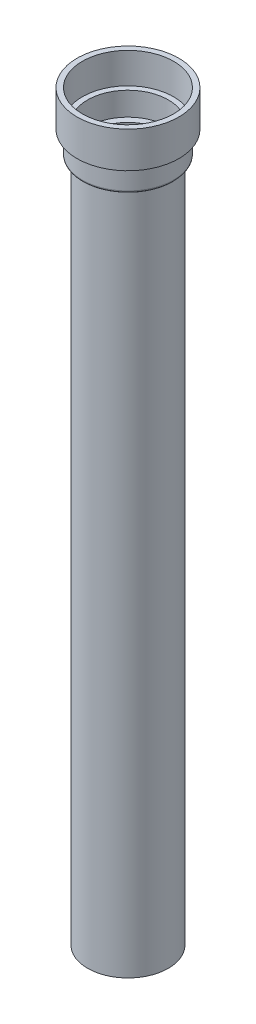
ISO-10303-21;
HEADER;
FILE_DESCRIPTION(('STEP AP214'),'2;1');
FILE_NAME('part.step','',(''),(''),'','','');
FILE_SCHEMA(('AUTOMOTIVE_DESIGN { 1 0 10303 214 1 1 1 1 }'));
ENDSEC;
DATA;
#1=APPLICATION_CONTEXT('core data for automotive mechanical design processes');
#2=APPLICATION_PROTOCOL_DEFINITION('international standard','automotive_design',2000,#1);
#3=PRODUCT_CONTEXT('',#1,'mechanical');
#4=PRODUCT('Part','Part','',(#3));
#5=PRODUCT_RELATED_PRODUCT_CATEGORY('part','',(#4));
#6=PRODUCT_DEFINITION_FORMATION('','',#4);
#7=PRODUCT_DEFINITION_CONTEXT('part definition',#1,'design');
#8=PRODUCT_DEFINITION('design','',#6,#7);
#9=PRODUCT_DEFINITION_SHAPE('','',#8);
#10=(LENGTH_UNIT() NAMED_UNIT(*) SI_UNIT(.MILLI.,.METRE.));
#11=(NAMED_UNIT(*) PLANE_ANGLE_UNIT() SI_UNIT($,.RADIAN.));
#12=(NAMED_UNIT(*) SI_UNIT($,.STERADIAN.) SOLID_ANGLE_UNIT());
#13=UNCERTAINTY_MEASURE_WITH_UNIT(LENGTH_MEASURE(1.E-05),#10,'distance_accuracy_value','');
#14=(GEOMETRIC_REPRESENTATION_CONTEXT(3) GLOBAL_UNCERTAINTY_ASSIGNED_CONTEXT((#13)) GLOBAL_UNIT_ASSIGNED_CONTEXT((#10,
#11,#12)) REPRESENTATION_CONTEXT('',''));
#15=CARTESIAN_POINT('',(0.,0.,0.));
#16=DIRECTION('',(0.,0.,1.));
#17=DIRECTION('',(1.,0.,0.));
#18=AXIS2_PLACEMENT_3D('',#15,#16,#17);
#19=CARTESIAN_POINT('',(0.,-347.5,0.));
#20=DIRECTION('',(0.,1.,0.));
#21=DIRECTION('',(0.,0.,1.));
#22=AXIS2_PLACEMENT_3D('',#19,#20,#21);
#23=PLANE('',#22);
#24=CARTESIAN_POINT('',(0.,-347.5,0.));
#25=DIRECTION('',(0.,1.,0.));
#26=DIRECTION('',(0.,0.,1.));
#27=AXIS2_PLACEMENT_3D('',#24,#25,#26);
#28=CIRCLE('',#27,16.);
#29=CARTESIAN_POINT('',(0.,-347.5,16.));
#30=VERTEX_POINT('',#29);
#31=EDGE_CURVE('E41',#30,#30,#28,.T.);
#32=ORIENTED_EDGE('',*,*,#31,.T.);
#33=EDGE_LOOP('',(#32));
#34=FACE_BOUND('',#33,.T.);
#35=ADVANCED_FACE('F30',(#34),#23,.T.);
#36=CARTESIAN_POINT('',(0.,0.,0.));
#37=DIRECTION('',(0.,1.,0.));
#38=DIRECTION('',(0.,0.,1.));
#39=AXIS2_PLACEMENT_3D('',#36,#37,#38);
#40=CYLINDRICAL_SURFACE('',#39,16.);
#41=CARTESIAN_POINT('',(0.,-25.5,0.));
#42=DIRECTION('',(0.,1.,0.));
#43=DIRECTION('',(0.,0.,1.));
#44=AXIS2_PLACEMENT_3D('',#41,#42,#43);
#45=CIRCLE('',#44,16.);
#46=CARTESIAN_POINT('',(0.,-25.5,16.));
#47=VERTEX_POINT('',#46);
#48=EDGE_CURVE('E45',#47,#47,#45,.T.);
#49=ORIENTED_EDGE('',*,*,#48,.T.);
#50=EDGE_LOOP('',(#49));
#51=FACE_BOUND('',#50,.T.);
#52=ORIENTED_EDGE('',*,*,#31,.F.);
#53=EDGE_LOOP('',(#52));
#54=FACE_BOUND('',#53,.T.);
#55=ADVANCED_FACE('F92',(#51,#54),#40,.F.);
#56=CARTESIAN_POINT('',(0.,-25.5,19.));
#57=DIRECTION('',(0.,1.,0.));
#58=DIRECTION('',(0.,0.,1.));
#59=AXIS2_PLACEMENT_3D('',#56,#57,#58);
#60=PLANE('',#59);
#61=CARTESIAN_POINT('',(0.,-25.5,0.));
#62=DIRECTION('',(0.,1.,0.));
#63=DIRECTION('',(0.,0.,1.));
#64=AXIS2_PLACEMENT_3D('',#61,#62,#63);
#65=CIRCLE('',#64,19.);
#66=CARTESIAN_POINT('',(0.,-25.5,19.));
#67=VERTEX_POINT('',#66);
#68=EDGE_CURVE('E50',#67,#67,#65,.T.);
#69=ORIENTED_EDGE('',*,*,#68,.T.);
#70=EDGE_LOOP('',(#69));
#71=FACE_BOUND('',#70,.T.);
#72=ORIENTED_EDGE('',*,*,#48,.F.);
#73=EDGE_LOOP('',(#72));
#74=FACE_BOUND('',#73,.T.);
#75=ADVANCED_FACE('F97',(#71,#74),#60,.T.);
#76=CARTESIAN_POINT('',(0.,0.,0.));
#77=DIRECTION('',(0.,1.,0.));
#78=DIRECTION('',(0.,0.,1.));
#79=AXIS2_PLACEMENT_3D('',#76,#77,#78);
#80=CYLINDRICAL_SURFACE('',#79,19.);
#81=CARTESIAN_POINT('',(0.,-14.5,0.));
#82=DIRECTION('',(0.,1.,0.));
#83=DIRECTION('',(0.,0.,1.));
#84=AXIS2_PLACEMENT_3D('',#81,#82,#83);
#85=CIRCLE('',#84,19.);
#86=CARTESIAN_POINT('',(0.,-14.5,19.));
#87=VERTEX_POINT('',#86);
#88=EDGE_CURVE('E53',#87,#87,#85,.T.);
#89=ORIENTED_EDGE('',*,*,#88,.T.);
#90=EDGE_LOOP('',(#89));
#91=FACE_BOUND('',#90,.T.);
#92=ORIENTED_EDGE('',*,*,#68,.F.);
#93=EDGE_LOOP('',(#92));
#94=FACE_BOUND('',#93,.T.);
#95=ADVANCED_FACE('F103',(#91,#94),#80,.F.);
#96=CARTESIAN_POINT('',(0.,-14.5,21.5));
#97=DIRECTION('',(0.,1.,0.));
#98=DIRECTION('',(0.,0.,1.));
#99=AXIS2_PLACEMENT_3D('',#96,#97,#98);
#100=PLANE('',#99);
#101=CARTESIAN_POINT('',(0.,-14.5,0.));
#102=DIRECTION('',(0.,1.,0.));
#103=DIRECTION('',(0.,0.,1.));
#104=AXIS2_PLACEMENT_3D('',#101,#102,#103);
#105=CIRCLE('',#104,21.5);
#106=CARTESIAN_POINT('',(0.,-14.5,21.5));
#107=VERTEX_POINT('',#106);
#108=EDGE_CURVE('E56',#107,#107,#105,.T.);
#109=ORIENTED_EDGE('',*,*,#108,.T.);
#110=EDGE_LOOP('',(#109));
#111=FACE_BOUND('',#110,.T.);
#112=ORIENTED_EDGE('',*,*,#88,.F.);
#113=EDGE_LOOP('',(#112));
#114=FACE_BOUND('',#113,.T.);
#115=ADVANCED_FACE('F107',(#111,#114),#100,.T.);
#116=CARTESIAN_POINT('',(0.,0.,0.));
#117=DIRECTION('',(0.,1.,0.));
#118=DIRECTION('',(0.,0.,1.));
#119=AXIS2_PLACEMENT_3D('',#116,#117,#118);
#120=CYLINDRICAL_SURFACE('',#119,21.5);
#121=CARTESIAN_POINT('',(0.,0.,0.));
#122=DIRECTION('',(0.,1.,0.));
#123=DIRECTION('',(0.,0.,1.));
#124=AXIS2_PLACEMENT_3D('',#121,#122,#123);
#125=CIRCLE('',#124,21.5);
#126=CARTESIAN_POINT('',(0.,0.,21.5));
#127=VERTEX_POINT('',#126);
#128=EDGE_CURVE('E59',#127,#127,#125,.T.);
#129=ORIENTED_EDGE('',*,*,#128,.T.);
#130=EDGE_LOOP('',(#129));
#131=FACE_BOUND('',#130,.T.);
#132=ORIENTED_EDGE('',*,*,#108,.F.);
#133=EDGE_LOOP('',(#132));
#134=FACE_BOUND('',#133,.T.);
#135=ADVANCED_FACE('F111',(#131,#134),#120,.F.);
#136=CARTESIAN_POINT('',(0.,0.,21.5));
#137=DIRECTION('',(0.,1.,0.));
#138=DIRECTION('',(0.,0.,1.));
#139=AXIS2_PLACEMENT_3D('',#136,#137,#138);
#140=PLANE('',#139);
#141=CARTESIAN_POINT('',(0.,0.,0.));
#142=DIRECTION('',(0.,1.,0.));
#143=DIRECTION('',(0.,0.,1.));
#144=AXIS2_PLACEMENT_3D('',#141,#142,#143);
#145=CIRCLE('',#144,24.);
#146=CARTESIAN_POINT('',(0.,0.,24.));
#147=VERTEX_POINT('',#146);
#148=EDGE_CURVE('E62',#147,#147,#145,.T.);
#149=ORIENTED_EDGE('',*,*,#148,.T.);
#150=EDGE_LOOP('',(#149));
#151=FACE_BOUND('',#150,.T.);
#152=ORIENTED_EDGE('',*,*,#128,.F.);
#153=EDGE_LOOP('',(#152));
#154=FACE_BOUND('',#153,.T.);
#155=ADVANCED_FACE('F115',(#151,#154),#140,.T.);
#156=CARTESIAN_POINT('',(0.,0.,0.));
#157=DIRECTION('',(0.,1.,0.));
#158=DIRECTION('',(0.,0.,1.));
#159=AXIS2_PLACEMENT_3D('',#156,#157,#158);
#160=CYLINDRICAL_SURFACE('',#159,24.);
#161=CARTESIAN_POINT('',(0.,-17.,0.));
#162=DIRECTION('',(0.,1.,0.));
#163=DIRECTION('',(0.,0.,1.));
#164=AXIS2_PLACEMENT_3D('',#161,#162,#163);
#165=CIRCLE('',#164,24.);
#166=CARTESIAN_POINT('',(0.,-17.,24.));
#167=VERTEX_POINT('',#166);
#168=EDGE_CURVE('E65',#167,#167,#165,.T.);
#169=ORIENTED_EDGE('',*,*,#168,.T.);
#170=EDGE_LOOP('',(#169));
#171=FACE_BOUND('',#170,.T.);
#172=ORIENTED_EDGE('',*,*,#148,.F.);
#173=EDGE_LOOP('',(#172));
#174=FACE_BOUND('',#173,.T.);
#175=ADVANCED_FACE('F119',(#171,#174),#160,.T.);
#176=CARTESIAN_POINT('',(0.,-17.,24.));
#177=DIRECTION('',(0.,-1.,0.));
#178=DIRECTION('',(0.,0.,-1.));
#179=AXIS2_PLACEMENT_3D('',#176,#177,#178);
#180=PLANE('',#179);
#181=CARTESIAN_POINT('',(0.,-17.,0.));
#182=DIRECTION('',(0.,1.,0.));
#183=DIRECTION('',(0.,0.,1.));
#184=AXIS2_PLACEMENT_3D('',#181,#182,#183);
#185=CIRCLE('',#184,21.5);
#186=CARTESIAN_POINT('',(0.,-17.,21.5));
#187=VERTEX_POINT('',#186);
#188=EDGE_CURVE('E68',#187,#187,#185,.T.);
#189=ORIENTED_EDGE('',*,*,#188,.T.);
#190=EDGE_LOOP('',(#189));
#191=FACE_BOUND('',#190,.T.);
#192=ORIENTED_EDGE('',*,*,#168,.F.);
#193=EDGE_LOOP('',(#192));
#194=FACE_BOUND('',#193,.T.);
#195=ADVANCED_FACE('F123',(#191,#194),#180,.T.);
#196=CARTESIAN_POINT('',(0.,0.,0.));
#197=DIRECTION('',(0.,1.,0.));
#198=DIRECTION('',(0.,0.,1.));
#199=AXIS2_PLACEMENT_3D('',#196,#197,#198);
#200=CYLINDRICAL_SURFACE('',#199,21.5);
#201=CARTESIAN_POINT('',(0.,-27.,0.));
#202=DIRECTION('',(0.,-1.,0.));
#203=DIRECTION('',(0.,0.,-1.));
#204=AXIS2_PLACEMENT_3D('',#201,#202,#203);
#205=CIRCLE('',#204,21.5);
#206=CARTESIAN_POINT('',(0.,-27.,-21.5));
#207=VERTEX_POINT('',#206);
#208=EDGE_CURVE('E37',#207,#207,#205,.F.);
#209=ORIENTED_EDGE('',*,*,#208,.T.);
#210=EDGE_LOOP('',(#209));
#211=FACE_BOUND('',#210,.T.);
#212=ORIENTED_EDGE('',*,*,#188,.F.);
#213=EDGE_LOOP('',(#212));
#214=FACE_BOUND('',#213,.T.);
#215=ADVANCED_FACE('F127',(#211,#214),#200,.T.);
#216=CARTESIAN_POINT('',(0.,-28.,21.5));
#217=DIRECTION('',(0.,-1.,0.));
#218=DIRECTION('',(0.,0.,-1.));
#219=AXIS2_PLACEMENT_3D('',#216,#217,#218);
#220=PLANE('',#219);
#221=CARTESIAN_POINT('',(0.,-28.,0.));
#222=DIRECTION('',(0.,-1.,0.));
#223=DIRECTION('',(0.,0.,-1.));
#224=AXIS2_PLACEMENT_3D('',#221,#222,#223);
#225=CIRCLE('',#224,20.5);
#226=CARTESIAN_POINT('',(0.,-28.,-20.5));
#227=VERTEX_POINT('',#226);
#228=EDGE_CURVE('E10',#227,#227,#225,.T.);
#229=ORIENTED_EDGE('',*,*,#228,.T.);
#230=EDGE_LOOP('',(#229));
#231=FACE_BOUND('',#230,.T.);
#232=CARTESIAN_POINT('',(0.,-28.,0.));
#233=DIRECTION('',(0.,1.,0.));
#234=DIRECTION('',(0.,0.,1.));
#235=AXIS2_PLACEMENT_3D('',#232,#233,#234);
#236=CIRCLE('',#235,19.);
#237=CARTESIAN_POINT('',(0.,-28.,19.));
#238=VERTEX_POINT('',#237);
#239=EDGE_CURVE('E71',#238,#238,#236,.T.);
#240=ORIENTED_EDGE('',*,*,#239,.T.);
#241=EDGE_LOOP('',(#240));
#242=FACE_BOUND('',#241,.T.);
#243=ADVANCED_FACE('F89',(#231,#242),#220,.T.);
#244=CARTESIAN_POINT('',(0.,0.,0.));
#245=DIRECTION('',(0.,1.,0.));
#246=DIRECTION('',(0.,0.,1.));
#247=AXIS2_PLACEMENT_3D('',#244,#245,#246);
#248=CYLINDRICAL_SURFACE('',#247,19.);
#249=CARTESIAN_POINT('',(0.,-350.,0.));
#250=DIRECTION('',(0.,1.,0.));
#251=DIRECTION('',(0.,0.,1.));
#252=AXIS2_PLACEMENT_3D('',#249,#250,#251);
#253=CIRCLE('',#252,19.);
#254=CARTESIAN_POINT('',(0.,-350.,19.));
#255=VERTEX_POINT('',#254);
#256=EDGE_CURVE('E74',#255,#255,#253,.T.);
#257=ORIENTED_EDGE('',*,*,#256,.T.);
#258=EDGE_LOOP('',(#257));
#259=FACE_BOUND('',#258,.T.);
#260=ORIENTED_EDGE('',*,*,#239,.F.);
#261=EDGE_LOOP('',(#260));
#262=FACE_BOUND('',#261,.T.);
#263=ADVANCED_FACE('F78',(#259,#262),#248,.T.);
#264=CARTESIAN_POINT('',(0.,-350.,19.));
#265=DIRECTION('',(0.,-1.,0.));
#266=DIRECTION('',(0.,0.,-1.));
#267=AXIS2_PLACEMENT_3D('',#264,#265,#266);
#268=PLANE('',#267);
#269=ORIENTED_EDGE('',*,*,#256,.F.);
#270=EDGE_LOOP('',(#269));
#271=FACE_BOUND('',#270,.T.);
#272=ADVANCED_FACE('F81',(#271),#268,.T.);
#273=CARTESIAN_POINT('',(0.,-27.,0.));
#274=DIRECTION('',(0.,-1.,0.));
#275=DIRECTION('',(0.,0.,-1.));
#276=AXIS2_PLACEMENT_3D('',#273,#274,#275);
#277=TOROIDAL_SURFACE('',#276,20.5,1.);
#278=ORIENTED_EDGE('',*,*,#228,.F.);
#279=EDGE_LOOP('',(#278));
#280=FACE_BOUND('',#279,.T.);
#281=ORIENTED_EDGE('',*,*,#208,.F.);
#282=EDGE_LOOP('',(#281));
#283=FACE_BOUND('',#282,.T.);
#284=ADVANCED_FACE('F32',(#280,#283),#277,.T.);
#285=CLOSED_SHELL('',(#35,#55,#75,#95,#115,#135,#155,#175,#195,#215,#243,#263,#272,#284));
#286=MANIFOLD_SOLID_BREP('B2',#285);
#287=ADVANCED_BREP_SHAPE_REPRESENTATION('',(#18,#286),#14);
#288=SHAPE_DEFINITION_REPRESENTATION(#9,#287);
ENDSEC;
END-ISO-10303-21;
